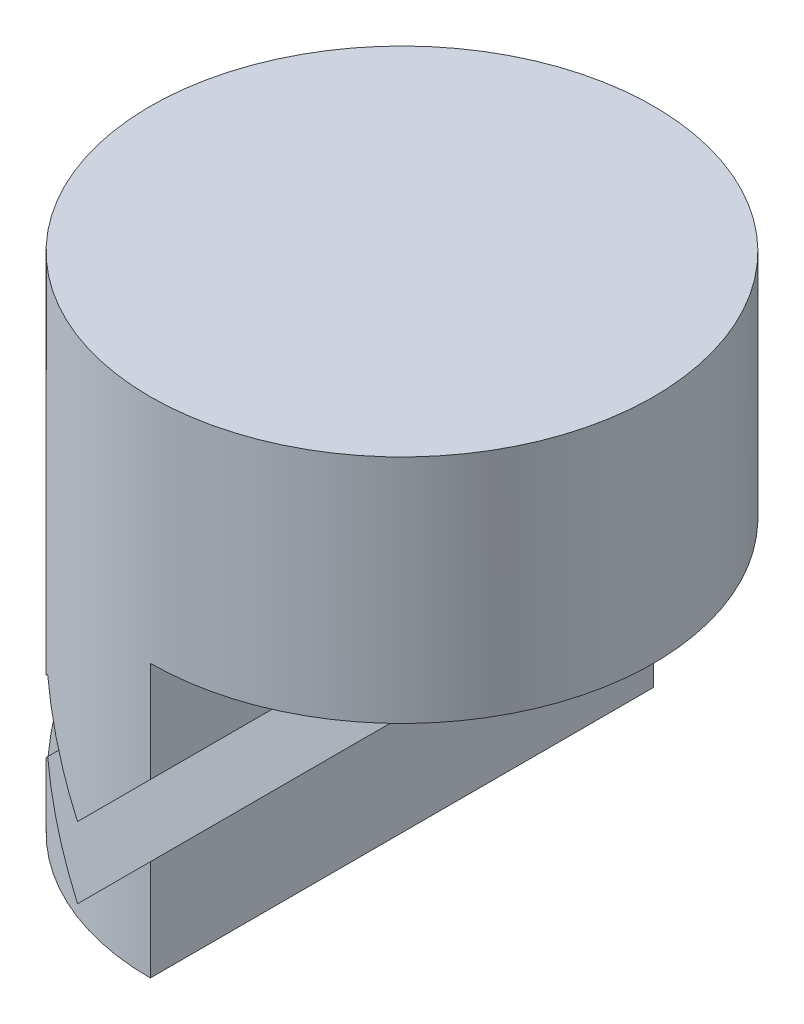
ISO-10303-21;
HEADER;
FILE_DESCRIPTION(('STEP AP214'),'2;1');
FILE_NAME('part.step','',(''),(''),'','','');
FILE_SCHEMA(('AUTOMOTIVE_DESIGN { 1 0 10303 214 1 1 1 1 }'));
ENDSEC;
DATA;
#1=APPLICATION_CONTEXT('core data for automotive mechanical design processes');
#2=APPLICATION_PROTOCOL_DEFINITION('international standard','automotive_design',2000,#1);
#3=PRODUCT_CONTEXT('',#1,'mechanical');
#4=PRODUCT('Part','Part','',(#3));
#5=PRODUCT_RELATED_PRODUCT_CATEGORY('part','',(#4));
#6=PRODUCT_DEFINITION_FORMATION('','',#4);
#7=PRODUCT_DEFINITION_CONTEXT('part definition',#1,'design');
#8=PRODUCT_DEFINITION('design','',#6,#7);
#9=PRODUCT_DEFINITION_SHAPE('','',#8);
#10=(LENGTH_UNIT() NAMED_UNIT(*) SI_UNIT(.MILLI.,.METRE.));
#11=(NAMED_UNIT(*) PLANE_ANGLE_UNIT() SI_UNIT($,.RADIAN.));
#12=(NAMED_UNIT(*) SI_UNIT($,.STERADIAN.) SOLID_ANGLE_UNIT());
#13=UNCERTAINTY_MEASURE_WITH_UNIT(LENGTH_MEASURE(1.E-05),#10,'distance_accuracy_value','');
#14=(GEOMETRIC_REPRESENTATION_CONTEXT(3) GLOBAL_UNCERTAINTY_ASSIGNED_CONTEXT((#13)) GLOBAL_UNIT_ASSIGNED_CONTEXT((#10,
#11,#12)) REPRESENTATION_CONTEXT('',''));
#15=CARTESIAN_POINT('',(0.,0.,0.));
#16=DIRECTION('',(0.,0.,1.));
#17=DIRECTION('',(1.,0.,0.));
#18=AXIS2_PLACEMENT_3D('',#15,#16,#17);
#19=CARTESIAN_POINT('',(0.,100.,0.));
#20=DIRECTION('',(0.,-1.,0.));
#21=DIRECTION('',(0.,0.,-1.));
#22=AXIS2_PLACEMENT_3D('',#19,#20,#21);
#23=CYLINDRICAL_SURFACE('',#22,50.);
#24=CARTESIAN_POINT('',(0.,100.,0.));
#25=DIRECTION('',(0.,1.,0.));
#26=DIRECTION('',(0.,0.,1.));
#27=AXIS2_PLACEMENT_3D('',#24,#25,#26);
#28=CIRCLE('',#27,50.);
#29=CARTESIAN_POINT('',(0.,100.,50.));
#30=VERTEX_POINT('',#29);
#31=EDGE_CURVE('E130',#30,#30,#28,.T.);
#32=ORIENTED_EDGE('',*,*,#31,.F.);
#33=EDGE_LOOP('',(#32));
#34=FACE_BOUND('',#33,.T.);
#35=CARTESIAN_POINT('',(0.,-1.26025472505571,0.));
#36=DIRECTION('',(0.707106781186547,0.707106781186548,0.));
#37=DIRECTION('',(0.707106781186548,-0.707106781186547,0.));
#38=AXIS2_PLACEMENT_3D('',#35,#36,#37);
#39=ELLIPSE('',#38,70.7106781186547,50.);
#40=CARTESIAN_POINT('',(-31.8433307981243,30.5830760730686,38.5487001555335));
#41=VERTEX_POINT('',#40);
#42=CARTESIAN_POINT('',(-17.7011951743934,16.4409404493376,46.7618187135406));
#43=VERTEX_POINT('',#42);
#44=EDGE_CURVE('E48',#41,#43,#39,.T.);
#45=ORIENTED_EDGE('',*,*,#44,.T.);
#46=CARTESIAN_POINT('',(0.,34.142135623731,0.));
#47=DIRECTION('',(-0.707106781186548,0.707106781186547,0.));
#48=DIRECTION('',(-0.707106781186547,-0.707106781186548,0.));
#49=AXIS2_PLACEMENT_3D('',#46,#47,#48);
#50=ELLIPSE('',#49,70.7106781186548,50.);
#51=CARTESIAN_POINT('',(0.,34.142135623731,50.));
#52=VERTEX_POINT('',#51);
#53=EDGE_CURVE('E11',#43,#52,#50,.T.);
#54=ORIENTED_EDGE('',*,*,#53,.T.);
#55=DIRECTION('',(0.,-1.,0.));
#56=VECTOR('',#55,1.);
#57=CARTESIAN_POINT('',(0.,34.142135623731,50.));
#58=LINE('',#57,#56);
#59=CARTESIAN_POINT('',(0.,54.142135623731,50.));
#60=VERTEX_POINT('',#59);
#61=EDGE_CURVE('E136',#60,#52,#58,.T.);
#62=ORIENTED_EDGE('',*,*,#61,.F.);
#63=CARTESIAN_POINT('',(0.,54.142135623731,0.));
#64=DIRECTION('',(0.,1.,0.));
#65=DIRECTION('',(0.,0.,1.));
#66=AXIS2_PLACEMENT_3D('',#63,#64,#65);
#67=CIRCLE('',#66,50.);
#68=CARTESIAN_POINT('',(0.,54.142135623731,-50.));
#69=VERTEX_POINT('',#68);
#70=EDGE_CURVE('E121',#60,#69,#67,.T.);
#71=ORIENTED_EDGE('',*,*,#70,.T.);
#72=DIRECTION('',(0.,-1.,0.));
#73=VECTOR('',#72,1.);
#74=CARTESIAN_POINT('',(0.,34.142135623731,-50.));
#75=LINE('',#74,#73);
#76=CARTESIAN_POINT('',(0.,34.142135623731,-50.));
#77=VERTEX_POINT('',#76);
#78=EDGE_CURVE('E137',#69,#77,#75,.T.);
#79=ORIENTED_EDGE('',*,*,#78,.T.);
#80=CARTESIAN_POINT('',(-17.7011951743934,16.4409404493376,-46.7618187135406));
#81=VERTEX_POINT('',#80);
#82=EDGE_CURVE('E50',#77,#81,#50,.T.);
#83=ORIENTED_EDGE('',*,*,#82,.T.);
#84=CARTESIAN_POINT('',(-31.8433307981243,30.5830760730686,-38.5487001555335));
#85=VERTEX_POINT('',#84);
#86=EDGE_CURVE('E192',#81,#85,#39,.T.);
#87=ORIENTED_EDGE('',*,*,#86,.T.);
#88=CARTESIAN_POINT('',(0.,62.4264068711929,0.));
#89=DIRECTION('',(-0.707106781186547,0.707106781186547,0.));
#90=DIRECTION('',(-0.707106781186548,-0.707106781186548,0.));
#91=AXIS2_PLACEMENT_3D('',#88,#89,#90);
#92=ELLIPSE('',#91,70.7106781186548,50.);
#93=CARTESIAN_POINT('',(-45.9619407771256,16.4644660940673,-19.6850196850295));
#94=VERTEX_POINT('',#93);
#95=EDGE_CURVE('E196',#85,#94,#92,.T.);
#96=ORIENTED_EDGE('',*,*,#95,.T.);
#97=CARTESIAN_POINT('',(0.,-29.4974746830583,0.));
#98=DIRECTION('',(-0.707106781186547,-0.707106781186548,0.));
#99=DIRECTION('',(0.707106781186548,-0.707106781186547,0.));
#100=AXIS2_PLACEMENT_3D('',#97,#98,#99);
#101=ELLIPSE('',#100,70.7106781186547,50.);
#102=CARTESIAN_POINT('',(-38.8908729652601,9.39339828220182,-31.4245127249413));
#103=VERTEX_POINT('',#102);
#104=EDGE_CURVE('E200',#94,#103,#101,.T.);
#105=ORIENTED_EDGE('',*,*,#104,.T.);
#106=CARTESIAN_POINT('',(0.,48.284271247462,0.));
#107=DIRECTION('',(0.707106781186548,-0.707106781186547,0.));
#108=DIRECTION('',(-0.707106781186547,-0.707106781186548,0.));
#109=AXIS2_PLACEMENT_3D('',#106,#107,#108);
#110=ELLIPSE('',#109,70.7106781186548,50.);
#111=CARTESIAN_POINT('',(-31.8198051533947,16.4644660940673,-38.5681215513537));
#112=VERTEX_POINT('',#111);
#113=EDGE_CURVE('E205',#103,#112,#110,.T.);
#114=ORIENTED_EDGE('',*,*,#113,.T.);
#115=CARTESIAN_POINT('',(0.,-15.3553390593274,0.));
#116=DIRECTION('',(-0.707106781186547,-0.707106781186548,0.));
#117=DIRECTION('',(0.707106781186548,-0.707106781186547,0.));
#118=AXIS2_PLACEMENT_3D('',#115,#116,#117);
#119=ELLIPSE('',#118,70.7106781186547,50.);
#120=CARTESIAN_POINT('',(-17.6776695296637,2.32233047033631,-46.7707173346743));
#121=VERTEX_POINT('',#120);
#122=EDGE_CURVE('E209',#112,#121,#119,.T.);
#123=ORIENTED_EDGE('',*,*,#122,.T.);
#124=CARTESIAN_POINT('',(0.,20.,0.));
#125=DIRECTION('',(0.707106781186547,-0.707106781186547,0.));
#126=DIRECTION('',(-0.707106781186548,-0.707106781186548,0.));
#127=AXIS2_PLACEMENT_3D('',#124,#125,#126);
#128=ELLIPSE('',#127,70.7106781186548,50.);
#129=CARTESIAN_POINT('',(0.,20.,-50.));
#130=VERTEX_POINT('',#129);
#131=EDGE_CURVE('E42',#121,#130,#128,.T.);
#132=ORIENTED_EDGE('',*,*,#131,.T.);
#133=DIRECTION('',(0.,-1.,0.));
#134=VECTOR('',#133,1.);
#135=CARTESIAN_POINT('',(0.,0.,-50.));
#136=LINE('',#135,#134);
#137=CARTESIAN_POINT('',(0.,0.,-50.));
#138=VERTEX_POINT('',#137);
#139=EDGE_CURVE('E140',#130,#138,#136,.T.);
#140=ORIENTED_EDGE('',*,*,#139,.T.);
#141=CARTESIAN_POINT('',(0.,0.,0.));
#142=DIRECTION('',(0.,1.,0.));
#143=DIRECTION('',(0.,0.,1.));
#144=AXIS2_PLACEMENT_3D('',#141,#142,#143);
#145=CIRCLE('',#144,50.);
#146=CARTESIAN_POINT('',(0.,0.,50.));
#147=VERTEX_POINT('',#146);
#148=EDGE_CURVE('E156',#138,#147,#145,.T.);
#149=ORIENTED_EDGE('',*,*,#148,.T.);
#150=DIRECTION('',(0.,-1.,0.));
#151=VECTOR('',#150,1.);
#152=CARTESIAN_POINT('',(0.,0.,50.));
#153=LINE('',#152,#151);
#154=CARTESIAN_POINT('',(0.,20.,50.));
#155=VERTEX_POINT('',#154);
#156=EDGE_CURVE('E57',#155,#147,#153,.T.);
#157=ORIENTED_EDGE('',*,*,#156,.F.);
#158=CARTESIAN_POINT('',(-17.6776695296637,2.32233047033631,46.7707173346743));
#159=VERTEX_POINT('',#158);
#160=EDGE_CURVE('E215',#155,#159,#128,.T.);
#161=ORIENTED_EDGE('',*,*,#160,.T.);
#162=CARTESIAN_POINT('',(-31.8198051533947,16.4644660940673,38.5681215513537));
#163=VERTEX_POINT('',#162);
#164=EDGE_CURVE('E65',#159,#163,#119,.T.);
#165=ORIENTED_EDGE('',*,*,#164,.T.);
#166=CARTESIAN_POINT('',(-38.8908729652601,9.39339828220182,31.4245127249413));
#167=VERTEX_POINT('',#166);
#168=EDGE_CURVE('E210',#163,#167,#110,.T.);
#169=ORIENTED_EDGE('',*,*,#168,.T.);
#170=CARTESIAN_POINT('',(-45.9619407771256,16.4644660940673,19.6850196850295));
#171=VERTEX_POINT('',#170);
#172=EDGE_CURVE('E206',#167,#171,#101,.T.);
#173=ORIENTED_EDGE('',*,*,#172,.T.);
#174=EDGE_CURVE('E201',#171,#41,#92,.T.);
#175=ORIENTED_EDGE('',*,*,#174,.T.);
#176=EDGE_LOOP('',(#45,#54,#62,#71,#79,#83,#87,#96,#105,#114,#123,#132,#140,#149,#157,#161,#165,
#169,#173,#175));
#177=FACE_BOUND('',#176,.T.);
#178=ADVANCED_FACE('F39',(#34,#177),#23,.T.);
#179=CARTESIAN_POINT('',(0.,100.,0.));
#180=DIRECTION('',(0.,1.,0.));
#181=DIRECTION('',(0.,0.,1.));
#182=AXIS2_PLACEMENT_3D('',#179,#180,#181);
#183=PLANE('',#182);
#184=ORIENTED_EDGE('',*,*,#31,.T.);
#185=EDGE_LOOP('',(#184));
#186=FACE_BOUND('',#185,.T.);
#187=ADVANCED_FACE('F257',(#186),#183,.T.);
#188=CARTESIAN_POINT('',(0.,0.,0.));
#189=DIRECTION('',(0.,1.,0.));
#190=DIRECTION('',(0.,0.,1.));
#191=AXIS2_PLACEMENT_3D('',#188,#189,#190);
#192=PLANE('',#191);
#193=ORIENTED_EDGE('',*,*,#148,.F.);
#194=DIRECTION('',(0.,0.,1.));
#195=VECTOR('',#194,1.);
#196=CARTESIAN_POINT('',(0.,0.,-50.));
#197=LINE('',#196,#195);
#198=EDGE_CURVE('E153',#138,#147,#197,.T.);
#199=ORIENTED_EDGE('',*,*,#198,.T.);
#200=EDGE_LOOP('',(#193,#199));
#201=FACE_BOUND('',#200,.T.);
#202=ADVANCED_FACE('F262',(#201),#192,.F.);
#203=CARTESIAN_POINT('',(0.,20.,-50.));
#204=DIRECTION('',(0.707106781186547,-0.707106781186547,0.));
#205=DIRECTION('',(0.707106781186548,0.707106781186548,0.));
#206=AXIS2_PLACEMENT_3D('',#203,#204,#205);
#207=PLANE('',#206);
#208=DIRECTION('',(0.,0.,1.));
#209=VECTOR('',#208,1.);
#210=CARTESIAN_POINT('',(-17.6776695296637,2.32233047033631,-50.));
#211=LINE('',#210,#209);
#212=EDGE_CURVE('E160',#121,#159,#211,.T.);
#213=ORIENTED_EDGE('',*,*,#212,.T.);
#214=ORIENTED_EDGE('',*,*,#160,.F.);
#215=DIRECTION('',(0.,0.,1.));
#216=VECTOR('',#215,1.);
#217=CARTESIAN_POINT('',(0.,20.,-50.));
#218=LINE('',#217,#216);
#219=EDGE_CURVE('E157',#130,#155,#218,.T.);
#220=ORIENTED_EDGE('',*,*,#219,.F.);
#221=ORIENTED_EDGE('',*,*,#131,.F.);
#222=EDGE_LOOP('',(#213,#214,#220,#221));
#223=FACE_BOUND('',#222,.T.);
#224=ADVANCED_FACE('F222',(#223),#207,.F.);
#225=CARTESIAN_POINT('',(-31.8198051533947,16.4644660940673,-50.));
#226=DIRECTION('',(-0.707106781186547,-0.707106781186548,0.));
#227=DIRECTION('',(0.707106781186548,-0.707106781186547,0.));
#228=AXIS2_PLACEMENT_3D('',#225,#226,#227);
#229=PLANE('',#228);
#230=ORIENTED_EDGE('',*,*,#212,.F.);
#231=ORIENTED_EDGE('',*,*,#122,.F.);
#232=DIRECTION('',(0.,0.,1.));
#233=VECTOR('',#232,1.);
#234=CARTESIAN_POINT('',(-31.8198051533947,16.4644660940673,-50.));
#235=LINE('',#234,#233);
#236=EDGE_CURVE('E163',#112,#163,#235,.T.);
#237=ORIENTED_EDGE('',*,*,#236,.T.);
#238=ORIENTED_EDGE('',*,*,#164,.F.);
#239=EDGE_LOOP('',(#230,#231,#237,#238));
#240=FACE_BOUND('',#239,.T.);
#241=ADVANCED_FACE('F226',(#240),#229,.F.);
#242=CARTESIAN_POINT('',(-31.8198051533947,16.4644660940673,-50.));
#243=DIRECTION('',(0.707106781186548,-0.707106781186547,0.));
#244=DIRECTION('',(0.707106781186547,0.707106781186548,0.));
#245=AXIS2_PLACEMENT_3D('',#242,#243,#244);
#246=PLANE('',#245);
#247=DIRECTION('',(0.,0.,1.));
#248=VECTOR('',#247,1.);
#249=CARTESIAN_POINT('',(-38.8908729652601,9.39339828220182,-50.));
#250=LINE('',#249,#248);
#251=EDGE_CURVE('E166',#103,#167,#250,.T.);
#252=ORIENTED_EDGE('',*,*,#251,.T.);
#253=ORIENTED_EDGE('',*,*,#168,.F.);
#254=ORIENTED_EDGE('',*,*,#236,.F.);
#255=ORIENTED_EDGE('',*,*,#113,.F.);
#256=EDGE_LOOP('',(#252,#253,#254,#255));
#257=FACE_BOUND('',#256,.T.);
#258=ADVANCED_FACE('F229',(#257),#246,.F.);
#259=CARTESIAN_POINT('',(-38.8908729652601,9.39339828220182,-50.));
#260=DIRECTION('',(-0.707106781186547,-0.707106781186548,0.));
#261=DIRECTION('',(0.707106781186548,-0.707106781186547,0.));
#262=AXIS2_PLACEMENT_3D('',#259,#260,#261);
#263=PLANE('',#262);
#264=ORIENTED_EDGE('',*,*,#251,.F.);
#265=ORIENTED_EDGE('',*,*,#104,.F.);
#266=DIRECTION('',(0.,0.,1.));
#267=VECTOR('',#266,1.);
#268=CARTESIAN_POINT('',(-45.9619407771256,16.4644660940673,-50.));
#269=LINE('',#268,#267);
#270=EDGE_CURVE('E170',#94,#171,#269,.T.);
#271=ORIENTED_EDGE('',*,*,#270,.T.);
#272=ORIENTED_EDGE('',*,*,#172,.F.);
#273=EDGE_LOOP('',(#264,#265,#271,#272));
#274=FACE_BOUND('',#273,.T.);
#275=ADVANCED_FACE('F233',(#274),#263,.F.);
#276=CARTESIAN_POINT('',(-45.9619407771256,16.4644660940673,-50.));
#277=DIRECTION('',(-0.707106781186547,0.707106781186547,0.));
#278=DIRECTION('',(-0.707106781186548,-0.707106781186548,0.));
#279=AXIS2_PLACEMENT_3D('',#276,#277,#278);
#280=PLANE('',#279);
#281=ORIENTED_EDGE('',*,*,#270,.F.);
#282=ORIENTED_EDGE('',*,*,#95,.F.);
#283=DIRECTION('',(0.,0.,1.));
#284=VECTOR('',#283,1.);
#285=CARTESIAN_POINT('',(-31.8433307981243,30.5830760730686,-50.));
#286=LINE('',#285,#284);
#287=EDGE_CURVE('E174',#85,#41,#286,.T.);
#288=ORIENTED_EDGE('',*,*,#287,.T.);
#289=ORIENTED_EDGE('',*,*,#174,.F.);
#290=EDGE_LOOP('',(#281,#282,#288,#289));
#291=FACE_BOUND('',#290,.T.);
#292=ADVANCED_FACE('F236',(#291),#280,.F.);
#293=CARTESIAN_POINT('',(-17.7011951743934,16.4409404493376,-50.));
#294=DIRECTION('',(0.707106781186547,0.707106781186548,0.));
#295=DIRECTION('',(-0.707106781186548,0.707106781186547,0.));
#296=AXIS2_PLACEMENT_3D('',#293,#294,#295);
#297=PLANE('',#296);
#298=DIRECTION('',(0.,0.,1.));
#299=VECTOR('',#298,1.);
#300=CARTESIAN_POINT('',(-17.7011951743934,16.4409404493376,-50.));
#301=LINE('',#300,#299);
#302=EDGE_CURVE('E178',#81,#43,#301,.T.);
#303=ORIENTED_EDGE('',*,*,#302,.T.);
#304=ORIENTED_EDGE('',*,*,#44,.F.);
#305=ORIENTED_EDGE('',*,*,#287,.F.);
#306=ORIENTED_EDGE('',*,*,#86,.F.);
#307=EDGE_LOOP('',(#303,#304,#305,#306));
#308=FACE_BOUND('',#307,.T.);
#309=ADVANCED_FACE('F243',(#308),#297,.F.);
#310=CARTESIAN_POINT('',(-17.7011951743934,16.4409404493376,-50.));
#311=DIRECTION('',(-0.707106781186548,0.707106781186547,0.));
#312=DIRECTION('',(-0.707106781186547,-0.707106781186548,0.));
#313=AXIS2_PLACEMENT_3D('',#310,#311,#312);
#314=PLANE('',#313);
#315=ORIENTED_EDGE('',*,*,#302,.F.);
#316=ORIENTED_EDGE('',*,*,#82,.F.);
#317=DIRECTION('',(0.,0.,1.));
#318=VECTOR('',#317,1.);
#319=CARTESIAN_POINT('',(0.,34.142135623731,-50.));
#320=LINE('',#319,#318);
#321=EDGE_CURVE('E139',#77,#52,#320,.T.);
#322=ORIENTED_EDGE('',*,*,#321,.T.);
#323=ORIENTED_EDGE('',*,*,#53,.F.);
#324=EDGE_LOOP('',(#315,#316,#322,#323));
#325=FACE_BOUND('',#324,.T.);
#326=ADVANCED_FACE('F246',(#325),#314,.F.);
#327=CARTESIAN_POINT('',(0.,54.142135623731,-50.));
#328=DIRECTION('',(0.,1.,0.));
#329=DIRECTION('',(0.,0.,1.));
#330=AXIS2_PLACEMENT_3D('',#327,#328,#329);
#331=PLANE('',#330);
#332=DIRECTION('',(0.,0.,1.));
#333=VECTOR('',#332,1.);
#334=CARTESIAN_POINT('',(0.,54.142135623731,-50.));
#335=LINE('',#334,#333);
#336=EDGE_CURVE('E124',#69,#60,#335,.T.);
#337=ORIENTED_EDGE('',*,*,#336,.F.);
#338=ORIENTED_EDGE('',*,*,#70,.F.);
#339=EDGE_LOOP('',(#337,#338));
#340=FACE_BOUND('',#339,.T.);
#341=ADVANCED_FACE('F123',(#340),#331,.F.);
#342=CARTESIAN_POINT('',(0.,0.,-50.));
#343=DIRECTION('',(-1.,0.,0.));
#344=DIRECTION('',(0.,0.,1.));
#345=AXIS2_PLACEMENT_3D('',#342,#343,#344);
#346=PLANE('',#345);
#347=ORIENTED_EDGE('',*,*,#198,.F.);
#348=ORIENTED_EDGE('',*,*,#139,.F.);
#349=ORIENTED_EDGE('',*,*,#219,.T.);
#350=ORIENTED_EDGE('',*,*,#156,.T.);
#351=EDGE_LOOP('',(#347,#348,#349,#350));
#352=FACE_BOUND('',#351,.T.);
#353=ADVANCED_FACE('F224',(#352),#346,.F.);
#354=CARTESIAN_POINT('',(0.,34.142135623731,-50.));
#355=DIRECTION('',(-1.,0.,0.));
#356=DIRECTION('',(0.,0.,1.));
#357=AXIS2_PLACEMENT_3D('',#354,#355,#356);
#358=PLANE('',#357);
#359=ORIENTED_EDGE('',*,*,#321,.F.);
#360=ORIENTED_EDGE('',*,*,#78,.F.);
#361=ORIENTED_EDGE('',*,*,#336,.T.);
#362=ORIENTED_EDGE('',*,*,#61,.T.);
#363=EDGE_LOOP('',(#359,#360,#361,#362));
#364=FACE_BOUND('',#363,.T.);
#365=ADVANCED_FACE('F135',(#364),#358,.F.);
#366=CLOSED_SHELL('',(#178,#187,#202,#224,#241,#258,#275,#292,#309,#326,#341,#353,#365));
#367=MANIFOLD_SOLID_BREP('B2',#366);
#368=ADVANCED_BREP_SHAPE_REPRESENTATION('',(#18,#367),#14);
#369=SHAPE_DEFINITION_REPRESENTATION(#9,#368);
ENDSEC;
END-ISO-10303-21;
